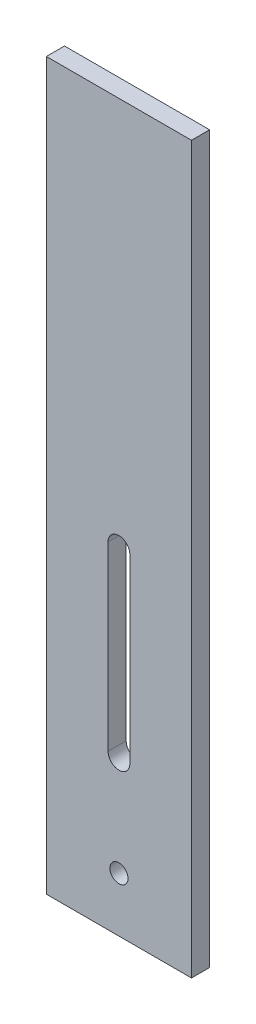
ISO-10303-21;
HEADER;
FILE_DESCRIPTION(('STEP AP214'),'2;1');
FILE_NAME('part.step','',(''),(''),'','','');
FILE_SCHEMA(('AUTOMOTIVE_DESIGN { 1 0 10303 214 1 1 1 1 }'));
ENDSEC;
DATA;
#1=APPLICATION_CONTEXT('core data for automotive mechanical design processes');
#2=APPLICATION_PROTOCOL_DEFINITION('international standard','automotive_design',2000,#1);
#3=PRODUCT_CONTEXT('',#1,'mechanical');
#4=PRODUCT('Part','Part','',(#3));
#5=PRODUCT_RELATED_PRODUCT_CATEGORY('part','',(#4));
#6=PRODUCT_DEFINITION_FORMATION('','',#4);
#7=PRODUCT_DEFINITION_CONTEXT('part definition',#1,'design');
#8=PRODUCT_DEFINITION('design','',#6,#7);
#9=PRODUCT_DEFINITION_SHAPE('','',#8);
#10=(LENGTH_UNIT() NAMED_UNIT(*) SI_UNIT(.MILLI.,.METRE.));
#11=(NAMED_UNIT(*) PLANE_ANGLE_UNIT() SI_UNIT($,.RADIAN.));
#12=(NAMED_UNIT(*) SI_UNIT($,.STERADIAN.) SOLID_ANGLE_UNIT());
#13=UNCERTAINTY_MEASURE_WITH_UNIT(LENGTH_MEASURE(1.E-05),#10,'distance_accuracy_value','');
#14=(GEOMETRIC_REPRESENTATION_CONTEXT(3) GLOBAL_UNCERTAINTY_ASSIGNED_CONTEXT((#13)) GLOBAL_UNIT_ASSIGNED_CONTEXT((#10,
#11,#12)) REPRESENTATION_CONTEXT('',''));
#15=CARTESIAN_POINT('',(0.,0.,0.));
#16=DIRECTION('',(0.,0.,1.));
#17=DIRECTION('',(1.,0.,0.));
#18=AXIS2_PLACEMENT_3D('',#15,#16,#17);
#19=CARTESIAN_POINT('',(0.,0.,5.));
#20=DIRECTION('',(0.,0.,-1.));
#21=DIRECTION('',(-1.,0.,0.));
#22=AXIS2_PLACEMENT_3D('',#19,#20,#21);
#23=PLANE('',#22);
#24=DIRECTION('',(0.,1.,0.));
#25=VECTOR('',#24,1.);
#26=CARTESIAN_POINT('',(0.,0.,5.));
#27=LINE('',#26,#25);
#28=CARTESIAN_POINT('',(0.,-199.999999999999,5.));
#29=VERTEX_POINT('',#28);
#30=CARTESIAN_POINT('',(0.,0.,5.));
#31=VERTEX_POINT('',#30);
#32=EDGE_CURVE('E137',#29,#31,#27,.T.);
#33=ORIENTED_EDGE('',*,*,#32,.T.);
#34=DIRECTION('',(-1.,0.,0.));
#35=VECTOR('',#34,1.);
#36=CARTESIAN_POINT('',(0.,0.,5.));
#37=LINE('',#36,#35);
#38=CARTESIAN_POINT('',(-40.,0.,5.));
#39=VERTEX_POINT('',#38);
#40=EDGE_CURVE('E140',#31,#39,#37,.T.);
#41=ORIENTED_EDGE('',*,*,#40,.T.);
#42=DIRECTION('',(0.,-1.,0.));
#43=VECTOR('',#42,1.);
#44=CARTESIAN_POINT('',(-40.,0.,5.));
#45=LINE('',#44,#43);
#46=CARTESIAN_POINT('',(-40.,-199.999999999999,5.));
#47=VERTEX_POINT('',#46);
#48=EDGE_CURVE('E143',#39,#47,#45,.T.);
#49=ORIENTED_EDGE('',*,*,#48,.T.);
#50=DIRECTION('',(1.,0.,0.));
#51=VECTOR('',#50,1.);
#52=CARTESIAN_POINT('',(0.,-199.999999999999,5.));
#53=LINE('',#52,#51);
#54=EDGE_CURVE('E145',#47,#29,#53,.T.);
#55=ORIENTED_EDGE('',*,*,#54,.T.);
#56=EDGE_LOOP('',(#33,#41,#49,#55));
#57=FACE_BOUND('',#56,.T.);
#58=CARTESIAN_POINT('',(-20.,-107.376368337973,5.));
#59=DIRECTION('',(0.,0.,1.));
#60=DIRECTION('',(1.,0.,0.));
#61=AXIS2_PLACEMENT_3D('',#58,#59,#60);
#62=CIRCLE('',#61,3.);
#63=CARTESIAN_POINT('',(-17.,-107.376368337973,5.));
#64=VERTEX_POINT('',#63);
#65=CARTESIAN_POINT('',(-23.,-107.376368337973,5.));
#66=VERTEX_POINT('',#65);
#67=EDGE_CURVE('E98',#64,#66,#62,.T.);
#68=ORIENTED_EDGE('',*,*,#67,.F.);
#69=DIRECTION('',(0.,1.,0.));
#70=VECTOR('',#69,1.);
#71=CARTESIAN_POINT('',(-17.,-107.376368337973,5.));
#72=LINE('',#71,#70);
#73=CARTESIAN_POINT('',(-17.,-157.376368337973,5.));
#74=VERTEX_POINT('',#73);
#75=EDGE_CURVE('E121',#74,#64,#72,.T.);
#76=ORIENTED_EDGE('',*,*,#75,.F.);
#77=CARTESIAN_POINT('',(-20.,-157.376368337973,5.));
#78=DIRECTION('',(0.,0.,1.));
#79=DIRECTION('',(1.,0.,0.));
#80=AXIS2_PLACEMENT_3D('',#77,#78,#79);
#81=CIRCLE('',#80,3.00000000000001);
#82=CARTESIAN_POINT('',(-23.,-157.376368337973,5.));
#83=VERTEX_POINT('',#82);
#84=EDGE_CURVE('E119',#83,#74,#81,.T.);
#85=ORIENTED_EDGE('',*,*,#84,.F.);
#86=DIRECTION('',(0.,-1.,0.));
#87=VECTOR('',#86,1.);
#88=CARTESIAN_POINT('',(-23.,-107.376368337973,5.));
#89=LINE('',#88,#87);
#90=EDGE_CURVE('E106',#66,#83,#89,.T.);
#91=ORIENTED_EDGE('',*,*,#90,.F.);
#92=EDGE_LOOP('',(#68,#76,#85,#91));
#93=FACE_BOUND('',#92,.T.);
#94=CARTESIAN_POINT('',(-20.,-185.,5.));
#95=DIRECTION('',(0.,0.,1.));
#96=DIRECTION('',(1.,0.,0.));
#97=AXIS2_PLACEMENT_3D('',#94,#95,#96);
#98=CIRCLE('',#97,2.5);
#99=CARTESIAN_POINT('',(-17.5,-185.,5.));
#100=VERTEX_POINT('',#99);
#101=EDGE_CURVE('E127',#100,#100,#98,.T.);
#102=ORIENTED_EDGE('',*,*,#101,.F.);
#103=EDGE_LOOP('',(#102));
#104=FACE_BOUND('',#103,.T.);
#105=ADVANCED_FACE('F33',(#57,#93,#104),#23,.F.);
#106=CARTESIAN_POINT('',(0.,0.,0.));
#107=DIRECTION('',(0.,0.,-1.));
#108=DIRECTION('',(-1.,0.,0.));
#109=AXIS2_PLACEMENT_3D('',#106,#107,#108);
#110=PLANE('',#109);
#111=DIRECTION('',(0.,1.,0.));
#112=VECTOR('',#111,1.);
#113=CARTESIAN_POINT('',(-17.,-107.376368337973,0.));
#114=LINE('',#113,#112);
#115=CARTESIAN_POINT('',(-17.,-157.376368337973,0.));
#116=VERTEX_POINT('',#115);
#117=CARTESIAN_POINT('',(-17.,-107.376368337973,0.));
#118=VERTEX_POINT('',#117);
#119=EDGE_CURVE('E107',#116,#118,#114,.T.);
#120=ORIENTED_EDGE('',*,*,#119,.T.);
#121=CARTESIAN_POINT('',(-20.,-107.376368337973,0.));
#122=DIRECTION('',(0.,0.,1.));
#123=DIRECTION('',(1.,0.,0.));
#124=AXIS2_PLACEMENT_3D('',#121,#122,#123);
#125=CIRCLE('',#124,3.);
#126=CARTESIAN_POINT('',(-23.,-107.376368337973,0.));
#127=VERTEX_POINT('',#126);
#128=EDGE_CURVE('E56',#118,#127,#125,.T.);
#129=ORIENTED_EDGE('',*,*,#128,.T.);
#130=DIRECTION('',(0.,-1.,0.));
#131=VECTOR('',#130,1.);
#132=CARTESIAN_POINT('',(-23.,-107.376368337973,0.));
#133=LINE('',#132,#131);
#134=CARTESIAN_POINT('',(-23.,-157.376368337973,0.));
#135=VERTEX_POINT('',#134);
#136=EDGE_CURVE('E113',#127,#135,#133,.T.);
#137=ORIENTED_EDGE('',*,*,#136,.T.);
#138=CARTESIAN_POINT('',(-20.,-157.376368337973,0.));
#139=DIRECTION('',(0.,0.,1.));
#140=DIRECTION('',(1.,0.,0.));
#141=AXIS2_PLACEMENT_3D('',#138,#139,#140);
#142=CIRCLE('',#141,3.00000000000001);
#143=EDGE_CURVE('E129',#135,#116,#142,.T.);
#144=ORIENTED_EDGE('',*,*,#143,.T.);
#145=EDGE_LOOP('',(#120,#129,#137,#144));
#146=FACE_BOUND('',#145,.T.);
#147=DIRECTION('',(0.,1.,0.));
#148=VECTOR('',#147,1.);
#149=CARTESIAN_POINT('',(0.,0.,0.));
#150=LINE('',#149,#148);
#151=CARTESIAN_POINT('',(0.,-199.999999999999,0.));
#152=VERTEX_POINT('',#151);
#153=CARTESIAN_POINT('',(0.,0.,0.));
#154=VERTEX_POINT('',#153);
#155=EDGE_CURVE('E114',#152,#154,#150,.T.);
#156=ORIENTED_EDGE('',*,*,#155,.F.);
#157=DIRECTION('',(1.,0.,0.));
#158=VECTOR('',#157,1.);
#159=CARTESIAN_POINT('',(0.,-199.999999999999,0.));
#160=LINE('',#159,#158);
#161=CARTESIAN_POINT('',(-40.,-199.999999999999,0.));
#162=VERTEX_POINT('',#161);
#163=EDGE_CURVE('E141',#162,#152,#160,.T.);
#164=ORIENTED_EDGE('',*,*,#163,.F.);
#165=DIRECTION('',(0.,-1.,0.));
#166=VECTOR('',#165,1.);
#167=CARTESIAN_POINT('',(-40.,0.,0.));
#168=LINE('',#167,#166);
#169=CARTESIAN_POINT('',(-40.,0.,0.));
#170=VERTEX_POINT('',#169);
#171=EDGE_CURVE('E152',#170,#162,#168,.T.);
#172=ORIENTED_EDGE('',*,*,#171,.F.);
#173=DIRECTION('',(-1.,0.,0.));
#174=VECTOR('',#173,1.);
#175=CARTESIAN_POINT('',(0.,0.,0.));
#176=LINE('',#175,#174);
#177=EDGE_CURVE('E150',#154,#170,#176,.T.);
#178=ORIENTED_EDGE('',*,*,#177,.F.);
#179=EDGE_LOOP('',(#156,#164,#172,#178));
#180=FACE_BOUND('',#179,.T.);
#181=CARTESIAN_POINT('',(-20.,-185.,0.));
#182=DIRECTION('',(0.,0.,1.));
#183=DIRECTION('',(1.,0.,0.));
#184=AXIS2_PLACEMENT_3D('',#181,#182,#183);
#185=CIRCLE('',#184,2.5);
#186=CARTESIAN_POINT('',(-17.5,-185.,0.));
#187=VERTEX_POINT('',#186);
#188=EDGE_CURVE('E224',#187,#187,#185,.T.);
#189=ORIENTED_EDGE('',*,*,#188,.T.);
#190=EDGE_LOOP('',(#189));
#191=FACE_BOUND('',#190,.T.);
#192=ADVANCED_FACE('F170',(#146,#180,#191),#110,.T.);
#193=CARTESIAN_POINT('',(0.,0.,5.));
#194=DIRECTION('',(-1.,0.,0.));
#195=DIRECTION('',(0.,-1.,0.));
#196=AXIS2_PLACEMENT_3D('',#193,#194,#195);
#197=PLANE('',#196);
#198=ORIENTED_EDGE('',*,*,#155,.T.);
#199=DIRECTION('',(0.,0.,-1.));
#200=VECTOR('',#199,1.);
#201=CARTESIAN_POINT('',(0.,0.,5.));
#202=LINE('',#201,#200);
#203=EDGE_CURVE('E11',#31,#154,#202,.T.);
#204=ORIENTED_EDGE('',*,*,#203,.F.);
#205=ORIENTED_EDGE('',*,*,#32,.F.);
#206=DIRECTION('',(0.,0.,-1.));
#207=VECTOR('',#206,1.);
#208=CARTESIAN_POINT('',(0.,-199.999999999999,5.));
#209=LINE('',#208,#207);
#210=EDGE_CURVE('E147',#29,#152,#209,.T.);
#211=ORIENTED_EDGE('',*,*,#210,.T.);
#212=EDGE_LOOP('',(#198,#204,#205,#211));
#213=FACE_BOUND('',#212,.T.);
#214=ADVANCED_FACE('F35',(#213),#197,.F.);
#215=CARTESIAN_POINT('',(0.,0.,5.));
#216=DIRECTION('',(0.,-1.,0.));
#217=DIRECTION('',(1.,0.,0.));
#218=AXIS2_PLACEMENT_3D('',#215,#216,#217);
#219=PLANE('',#218);
#220=ORIENTED_EDGE('',*,*,#177,.T.);
#221=DIRECTION('',(0.,0.,-1.));
#222=VECTOR('',#221,1.);
#223=CARTESIAN_POINT('',(-40.,0.,5.));
#224=LINE('',#223,#222);
#225=EDGE_CURVE('E41',#39,#170,#224,.T.);
#226=ORIENTED_EDGE('',*,*,#225,.F.);
#227=ORIENTED_EDGE('',*,*,#40,.F.);
#228=ORIENTED_EDGE('',*,*,#203,.T.);
#229=EDGE_LOOP('',(#220,#226,#227,#228));
#230=FACE_BOUND('',#229,.T.);
#231=ADVANCED_FACE('F180',(#230),#219,.F.);
#232=CARTESIAN_POINT('',(-40.,0.,5.));
#233=DIRECTION('',(1.,0.,0.));
#234=DIRECTION('',(0.,1.,0.));
#235=AXIS2_PLACEMENT_3D('',#232,#233,#234);
#236=PLANE('',#235);
#237=ORIENTED_EDGE('',*,*,#171,.T.);
#238=DIRECTION('',(0.,0.,-1.));
#239=VECTOR('',#238,1.);
#240=CARTESIAN_POINT('',(-40.,-199.999999999999,5.));
#241=LINE('',#240,#239);
#242=EDGE_CURVE('E157',#47,#162,#241,.T.);
#243=ORIENTED_EDGE('',*,*,#242,.F.);
#244=ORIENTED_EDGE('',*,*,#48,.F.);
#245=ORIENTED_EDGE('',*,*,#225,.T.);
#246=EDGE_LOOP('',(#237,#243,#244,#245));
#247=FACE_BOUND('',#246,.T.);
#248=ADVANCED_FACE('F164',(#247),#236,.F.);
#249=CARTESIAN_POINT('',(0.,-199.999999999999,5.));
#250=DIRECTION('',(0.,1.,0.));
#251=DIRECTION('',(0.,0.,1.));
#252=AXIS2_PLACEMENT_3D('',#249,#250,#251);
#253=PLANE('',#252);
#254=ORIENTED_EDGE('',*,*,#163,.T.);
#255=ORIENTED_EDGE('',*,*,#210,.F.);
#256=ORIENTED_EDGE('',*,*,#54,.F.);
#257=ORIENTED_EDGE('',*,*,#242,.T.);
#258=EDGE_LOOP('',(#254,#255,#256,#257));
#259=FACE_BOUND('',#258,.T.);
#260=ADVANCED_FACE('F174',(#259),#253,.F.);
#261=CARTESIAN_POINT('',(-20.,-107.376368337973,5.));
#262=DIRECTION('',(0.,0.,-1.));
#263=DIRECTION('',(-1.,0.,0.));
#264=AXIS2_PLACEMENT_3D('',#261,#262,#263);
#265=CYLINDRICAL_SURFACE('',#264,3.);
#266=ORIENTED_EDGE('',*,*,#128,.F.);
#267=DIRECTION('',(0.,0.,-1.));
#268=VECTOR('',#267,1.);
#269=CARTESIAN_POINT('',(-17.,-107.376368337973,5.));
#270=LINE('',#269,#268);
#271=EDGE_CURVE('E102',#64,#118,#270,.T.);
#272=ORIENTED_EDGE('',*,*,#271,.F.);
#273=ORIENTED_EDGE('',*,*,#67,.T.);
#274=DIRECTION('',(0.,0.,-1.));
#275=VECTOR('',#274,1.);
#276=CARTESIAN_POINT('',(-23.,-107.376368337973,5.));
#277=LINE('',#276,#275);
#278=EDGE_CURVE('E101',#66,#127,#277,.T.);
#279=ORIENTED_EDGE('',*,*,#278,.T.);
#280=EDGE_LOOP('',(#266,#272,#273,#279));
#281=FACE_BOUND('',#280,.T.);
#282=ADVANCED_FACE('F100',(#281),#265,.F.);
#283=CARTESIAN_POINT('',(-23.,-107.376368337973,5.));
#284=DIRECTION('',(1.,0.,0.));
#285=DIRECTION('',(0.,1.,0.));
#286=AXIS2_PLACEMENT_3D('',#283,#284,#285);
#287=PLANE('',#286);
#288=ORIENTED_EDGE('',*,*,#136,.F.);
#289=ORIENTED_EDGE('',*,*,#278,.F.);
#290=ORIENTED_EDGE('',*,*,#90,.T.);
#291=DIRECTION('',(0.,0.,-1.));
#292=VECTOR('',#291,1.);
#293=CARTESIAN_POINT('',(-23.,-157.376368337973,5.));
#294=LINE('',#293,#292);
#295=EDGE_CURVE('E115',#83,#135,#294,.T.);
#296=ORIENTED_EDGE('',*,*,#295,.T.);
#297=EDGE_LOOP('',(#288,#289,#290,#296));
#298=FACE_BOUND('',#297,.T.);
#299=ADVANCED_FACE('F110',(#298),#287,.T.);
#300=CARTESIAN_POINT('',(-20.,-157.376368337973,5.));
#301=DIRECTION('',(0.,0.,-1.));
#302=DIRECTION('',(-1.,0.,0.));
#303=AXIS2_PLACEMENT_3D('',#300,#301,#302);
#304=CYLINDRICAL_SURFACE('',#303,3.00000000000001);
#305=ORIENTED_EDGE('',*,*,#143,.F.);
#306=ORIENTED_EDGE('',*,*,#295,.F.);
#307=ORIENTED_EDGE('',*,*,#84,.T.);
#308=DIRECTION('',(0.,0.,-1.));
#309=VECTOR('',#308,1.);
#310=CARTESIAN_POINT('',(-17.,-157.376368337973,5.));
#311=LINE('',#310,#309);
#312=EDGE_CURVE('E48',#74,#116,#311,.T.);
#313=ORIENTED_EDGE('',*,*,#312,.T.);
#314=EDGE_LOOP('',(#305,#306,#307,#313));
#315=FACE_BOUND('',#314,.T.);
#316=ADVANCED_FACE('F204',(#315),#304,.F.);
#317=CARTESIAN_POINT('',(-17.,-107.376368337973,5.));
#318=DIRECTION('',(-1.,0.,0.));
#319=DIRECTION('',(0.,-1.,0.));
#320=AXIS2_PLACEMENT_3D('',#317,#318,#319);
#321=PLANE('',#320);
#322=ORIENTED_EDGE('',*,*,#119,.F.);
#323=ORIENTED_EDGE('',*,*,#312,.F.);
#324=ORIENTED_EDGE('',*,*,#75,.T.);
#325=ORIENTED_EDGE('',*,*,#271,.T.);
#326=EDGE_LOOP('',(#322,#323,#324,#325));
#327=FACE_BOUND('',#326,.T.);
#328=ADVANCED_FACE('F208',(#327),#321,.T.);
#329=CARTESIAN_POINT('',(-20.,-185.,5.));
#330=DIRECTION('',(0.,0.,-1.));
#331=DIRECTION('',(-1.,0.,0.));
#332=AXIS2_PLACEMENT_3D('',#329,#330,#331);
#333=CYLINDRICAL_SURFACE('',#332,2.5);
#334=ORIENTED_EDGE('',*,*,#101,.T.);
#335=EDGE_LOOP('',(#334));
#336=FACE_BOUND('',#335,.T.);
#337=ORIENTED_EDGE('',*,*,#188,.F.);
#338=EDGE_LOOP('',(#337));
#339=FACE_BOUND('',#338,.T.);
#340=ADVANCED_FACE('F214',(#336,#339),#333,.F.);
#341=CLOSED_SHELL('',(#105,#192,#214,#231,#248,#260,#282,#299,#316,#328,#340));
#342=MANIFOLD_SOLID_BREP('B2',#341);
#343=ADVANCED_BREP_SHAPE_REPRESENTATION('',(#18,#342),#14);
#344=SHAPE_DEFINITION_REPRESENTATION(#9,#343);
ENDSEC;
END-ISO-10303-21;
